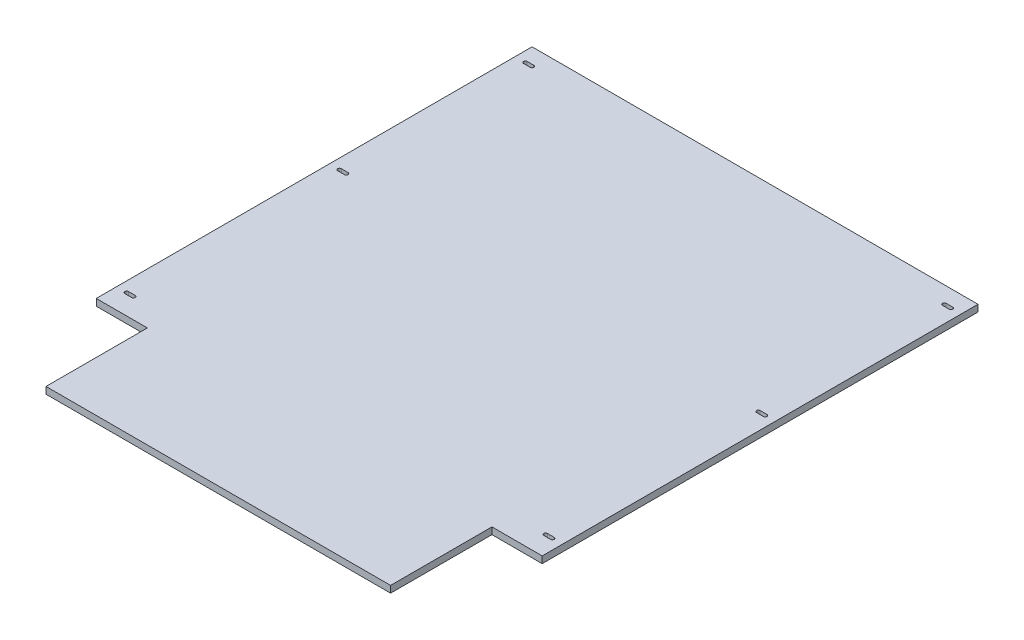
ISO-10303-21;
HEADER;
FILE_DESCRIPTION(('STEP AP214'),'2;1');
FILE_NAME('part.step','',(''),(''),'','','');
FILE_SCHEMA(('AUTOMOTIVE_DESIGN { 1 0 10303 214 1 1 1 1 }'));
ENDSEC;
DATA;
#1=APPLICATION_CONTEXT('core data for automotive mechanical design processes');
#2=APPLICATION_PROTOCOL_DEFINITION('international standard','automotive_design',2000,#1);
#3=PRODUCT_CONTEXT('',#1,'mechanical');
#4=PRODUCT('Part','Part','',(#3));
#5=PRODUCT_RELATED_PRODUCT_CATEGORY('part','',(#4));
#6=PRODUCT_DEFINITION_FORMATION('','',#4);
#7=PRODUCT_DEFINITION_CONTEXT('part definition',#1,'design');
#8=PRODUCT_DEFINITION('design','',#6,#7);
#9=PRODUCT_DEFINITION_SHAPE('','',#8);
#10=(LENGTH_UNIT() NAMED_UNIT(*) SI_UNIT(.MILLI.,.METRE.));
#11=(NAMED_UNIT(*) PLANE_ANGLE_UNIT() SI_UNIT($,.RADIAN.));
#12=(NAMED_UNIT(*) SI_UNIT($,.STERADIAN.) SOLID_ANGLE_UNIT());
#13=UNCERTAINTY_MEASURE_WITH_UNIT(LENGTH_MEASURE(1.E-05),#10,'distance_accuracy_value','');
#14=(GEOMETRIC_REPRESENTATION_CONTEXT(3) GLOBAL_UNCERTAINTY_ASSIGNED_CONTEXT((#13)) GLOBAL_UNIT_ASSIGNED_CONTEXT((#10,
#11,#12)) REPRESENTATION_CONTEXT('',''));
#15=CARTESIAN_POINT('',(0.,0.,0.));
#16=DIRECTION('',(0.,0.,1.));
#17=DIRECTION('',(1.,0.,0.));
#18=AXIS2_PLACEMENT_3D('',#15,#16,#17);
#19=CARTESIAN_POINT('',(0.,12.7,0.));
#20=DIRECTION('',(0.,1.,0.));
#21=DIRECTION('',(0.,0.,1.));
#22=AXIS2_PLACEMENT_3D('',#19,#20,#21);
#23=PLANE('',#22);
#24=DIRECTION('',(0.,0.,1.));
#25=VECTOR('',#24,1.);
#26=CARTESIAN_POINT('',(0.,12.7,-819.15));
#27=LINE('',#26,#25);
#28=CARTESIAN_POINT('',(0.,12.7,-819.15));
#29=VERTEX_POINT('',#28);
#30=CARTESIAN_POINT('',(0.,12.7,0.));
#31=VERTEX_POINT('',#30);
#32=EDGE_CURVE('E433',#29,#31,#27,.T.);
#33=ORIENTED_EDGE('',*,*,#32,.T.);
#34=DIRECTION('',(1.,0.,0.));
#35=VECTOR('',#34,1.);
#36=CARTESIAN_POINT('',(0.,12.7,0.));
#37=LINE('',#36,#35);
#38=CARTESIAN_POINT('',(96.04375,12.7,0.));
#39=VERTEX_POINT('',#38);
#40=EDGE_CURVE('E436',#31,#39,#37,.T.);
#41=ORIENTED_EDGE('',*,*,#40,.T.);
#42=DIRECTION('',(0.,0.,1.));
#43=VECTOR('',#42,1.);
#44=CARTESIAN_POINT('',(96.04375,12.7,0.));
#45=LINE('',#44,#43);
#46=CARTESIAN_POINT('',(96.04375,12.7,190.5));
#47=VERTEX_POINT('',#46);
#48=EDGE_CURVE('E439',#39,#47,#45,.T.);
#49=ORIENTED_EDGE('',*,*,#48,.T.);
#50=DIRECTION('',(1.,0.,0.));
#51=VECTOR('',#50,1.);
#52=CARTESIAN_POINT('',(96.04375,12.7,190.5));
#53=LINE('',#52,#51);
#54=CARTESIAN_POINT('',(743.74375,12.7,190.5));
#55=VERTEX_POINT('',#54);
#56=EDGE_CURVE('E441',#47,#55,#53,.T.);
#57=ORIENTED_EDGE('',*,*,#56,.T.);
#58=DIRECTION('',(0.,0.,-1.));
#59=VECTOR('',#58,1.);
#60=CARTESIAN_POINT('',(743.74375,12.7,190.5));
#61=LINE('',#60,#59);
#62=CARTESIAN_POINT('',(743.74375,12.7,0.));
#63=VERTEX_POINT('',#62);
#64=EDGE_CURVE('E443',#55,#63,#61,.T.);
#65=ORIENTED_EDGE('',*,*,#64,.T.);
#66=DIRECTION('',(1.,0.,0.));
#67=VECTOR('',#66,1.);
#68=CARTESIAN_POINT('',(743.74375,12.7,0.));
#69=LINE('',#68,#67);
#70=CARTESIAN_POINT('',(838.2,12.7,0.));
#71=VERTEX_POINT('',#70);
#72=EDGE_CURVE('E445',#63,#71,#69,.T.);
#73=ORIENTED_EDGE('',*,*,#72,.T.);
#74=DIRECTION('',(0.,0.,-1.));
#75=VECTOR('',#74,1.);
#76=CARTESIAN_POINT('',(838.2,12.7,0.));
#77=LINE('',#76,#75);
#78=CARTESIAN_POINT('',(838.2,12.7,-819.15));
#79=VERTEX_POINT('',#78);
#80=EDGE_CURVE('E447',#71,#79,#77,.T.);
#81=ORIENTED_EDGE('',*,*,#80,.T.);
#82=DIRECTION('',(-1.,0.,0.));
#83=VECTOR('',#82,1.);
#84=CARTESIAN_POINT('',(838.2,12.7,-819.15));
#85=LINE('',#84,#83);
#86=EDGE_CURVE('E449',#79,#29,#85,.T.);
#87=ORIENTED_EDGE('',*,*,#86,.T.);
#88=EDGE_LOOP('',(#33,#41,#49,#57,#65,#73,#81,#87));
#89=FACE_BOUND('',#88,.T.);
#90=DIRECTION('',(1.,0.,0.));
#91=VECTOR('',#90,1.);
#92=CARTESIAN_POINT('',(19.0500000000001,12.7,-34.7218));
#93=LINE('',#92,#91);
#94=CARTESIAN_POINT('',(19.0500000000001,12.7,-34.7218));
#95=VERTEX_POINT('',#94);
#96=CARTESIAN_POINT('',(31.7500000000001,12.7,-34.7218));
#97=VERTEX_POINT('',#96);
#98=EDGE_CURVE('E404',#95,#97,#93,.T.);
#99=ORIENTED_EDGE('',*,*,#98,.F.);
#100=CARTESIAN_POINT('',(19.0500000000001,12.7,-38.1));
#101=DIRECTION('',(0.,1.,0.));
#102=DIRECTION('',(0.,0.,1.));
#103=AXIS2_PLACEMENT_3D('',#100,#101,#102);
#104=CIRCLE('',#103,3.37819999999999);
#105=CARTESIAN_POINT('',(19.0500000000001,12.7,-41.4782));
#106=VERTEX_POINT('',#105);
#107=EDGE_CURVE('E402',#106,#95,#104,.T.);
#108=ORIENTED_EDGE('',*,*,#107,.F.);
#109=DIRECTION('',(-1.,0.,0.));
#110=VECTOR('',#109,1.);
#111=CARTESIAN_POINT('',(19.0500000000001,12.7,-41.4782));
#112=LINE('',#111,#110);
#113=CARTESIAN_POINT('',(31.7500000000001,12.7,-41.4782));
#114=VERTEX_POINT('',#113);
#115=EDGE_CURVE('E410',#114,#106,#112,.T.);
#116=ORIENTED_EDGE('',*,*,#115,.F.);
#117=CARTESIAN_POINT('',(31.7500000000001,12.7,-38.1));
#118=DIRECTION('',(0.,1.,0.));
#119=DIRECTION('',(0.,0.,1.));
#120=AXIS2_PLACEMENT_3D('',#117,#118,#119);
#121=CIRCLE('',#120,3.37819999999999);
#122=EDGE_CURVE('E407',#97,#114,#121,.T.);
#123=ORIENTED_EDGE('',*,*,#122,.F.);
#124=EDGE_LOOP('',(#99,#108,#116,#123));
#125=FACE_BOUND('',#124,.T.);
#126=DIRECTION('',(1.,0.,0.));
#127=VECTOR('',#126,1.);
#128=CARTESIAN_POINT('',(19.0500000000001,12.7,-434.7718));
#129=LINE('',#128,#127);
#130=CARTESIAN_POINT('',(19.0500000000001,12.7,-434.7718));
#131=VERTEX_POINT('',#130);
#132=CARTESIAN_POINT('',(31.7500000000001,12.7,-434.7718));
#133=VERTEX_POINT('',#132);
#134=EDGE_CURVE('E373',#131,#133,#129,.T.);
#135=ORIENTED_EDGE('',*,*,#134,.F.);
#136=CARTESIAN_POINT('',(19.0500000000001,12.7,-438.15));
#137=DIRECTION('',(0.,1.,0.));
#138=DIRECTION('',(0.,0.,1.));
#139=AXIS2_PLACEMENT_3D('',#136,#137,#138);
#140=CIRCLE('',#139,3.37820000000016);
#141=CARTESIAN_POINT('',(19.0500000000001,12.7,-441.5282));
#142=VERTEX_POINT('',#141);
#143=EDGE_CURVE('E371',#142,#131,#140,.T.);
#144=ORIENTED_EDGE('',*,*,#143,.F.);
#145=DIRECTION('',(-1.,0.,0.));
#146=VECTOR('',#145,1.);
#147=CARTESIAN_POINT('',(19.0500000000001,12.7,-441.5282));
#148=LINE('',#147,#146);
#149=CARTESIAN_POINT('',(31.7500000000001,12.7,-441.5282));
#150=VERTEX_POINT('',#149);
#151=EDGE_CURVE('E379',#150,#142,#148,.T.);
#152=ORIENTED_EDGE('',*,*,#151,.F.);
#153=CARTESIAN_POINT('',(31.7500000000001,12.7,-438.15));
#154=DIRECTION('',(0.,1.,0.));
#155=DIRECTION('',(0.,0.,1.));
#156=AXIS2_PLACEMENT_3D('',#153,#154,#155);
#157=CIRCLE('',#156,3.37820000000016);
#158=EDGE_CURVE('E376',#133,#150,#157,.T.);
#159=ORIENTED_EDGE('',*,*,#158,.F.);
#160=EDGE_LOOP('',(#135,#144,#152,#159));
#161=FACE_BOUND('',#160,.T.);
#162=DIRECTION('',(-1.,0.,0.));
#163=VECTOR('',#162,1.);
#164=CARTESIAN_POINT('',(31.7500000000001,12.7,-790.7782));
#165=LINE('',#164,#163);
#166=CARTESIAN_POINT('',(31.7500000000001,12.7,-790.7782));
#167=VERTEX_POINT('',#166);
#168=CARTESIAN_POINT('',(19.0500000000001,12.7,-790.7782));
#169=VERTEX_POINT('',#168);
#170=EDGE_CURVE('E342',#167,#169,#165,.T.);
#171=ORIENTED_EDGE('',*,*,#170,.F.);
#172=CARTESIAN_POINT('',(31.7500000000001,12.7,-787.4));
#173=DIRECTION('',(0.,1.,0.));
#174=DIRECTION('',(0.,0.,1.));
#175=AXIS2_PLACEMENT_3D('',#172,#173,#174);
#176=CIRCLE('',#175,3.3782);
#177=CARTESIAN_POINT('',(31.75,12.7,-784.0218));
#178=VERTEX_POINT('',#177);
#179=EDGE_CURVE('E340',#178,#167,#176,.T.);
#180=ORIENTED_EDGE('',*,*,#179,.F.);
#181=DIRECTION('',(1.,0.,0.));
#182=VECTOR('',#181,1.);
#183=CARTESIAN_POINT('',(31.75,12.7,-784.0218));
#184=LINE('',#183,#182);
#185=CARTESIAN_POINT('',(19.0500000000001,12.7,-784.0218));
#186=VERTEX_POINT('',#185);
#187=EDGE_CURVE('E348',#186,#178,#184,.T.);
#188=ORIENTED_EDGE('',*,*,#187,.F.);
#189=CARTESIAN_POINT('',(19.0500000000001,12.7,-787.4));
#190=DIRECTION('',(0.,1.,0.));
#191=DIRECTION('',(0.,0.,1.));
#192=AXIS2_PLACEMENT_3D('',#189,#190,#191);
#193=CIRCLE('',#192,3.3782);
#194=EDGE_CURVE('E345',#169,#186,#193,.T.);
#195=ORIENTED_EDGE('',*,*,#194,.F.);
#196=EDGE_LOOP('',(#171,#180,#188,#195));
#197=FACE_BOUND('',#196,.T.);
#198=DIRECTION('',(1.,0.,0.));
#199=VECTOR('',#198,1.);
#200=CARTESIAN_POINT('',(806.45,12.7,-784.0218));
#201=LINE('',#200,#199);
#202=CARTESIAN_POINT('',(806.45,12.7,-784.0218));
#203=VERTEX_POINT('',#202);
#204=CARTESIAN_POINT('',(819.15,12.7,-784.0218));
#205=VERTEX_POINT('',#204);
#206=EDGE_CURVE('E311',#203,#205,#201,.T.);
#207=ORIENTED_EDGE('',*,*,#206,.F.);
#208=CARTESIAN_POINT('',(806.45,12.7,-787.4));
#209=DIRECTION('',(0.,1.,0.));
#210=DIRECTION('',(0.,0.,-1.));
#211=AXIS2_PLACEMENT_3D('',#208,#209,#210);
#212=CIRCLE('',#211,3.3782);
#213=CARTESIAN_POINT('',(806.45,12.7,-790.7782));
#214=VERTEX_POINT('',#213);
#215=EDGE_CURVE('E309',#214,#203,#212,.T.);
#216=ORIENTED_EDGE('',*,*,#215,.F.);
#217=DIRECTION('',(-1.,0.,0.));
#218=VECTOR('',#217,1.);
#219=CARTESIAN_POINT('',(806.45,12.7,-790.7782));
#220=LINE('',#219,#218);
#221=CARTESIAN_POINT('',(819.15,12.7,-790.7782));
#222=VERTEX_POINT('',#221);
#223=EDGE_CURVE('E317',#222,#214,#220,.T.);
#224=ORIENTED_EDGE('',*,*,#223,.F.);
#225=CARTESIAN_POINT('',(819.15,12.7,-787.4));
#226=DIRECTION('',(0.,1.,0.));
#227=DIRECTION('',(0.,0.,-1.));
#228=AXIS2_PLACEMENT_3D('',#225,#226,#227);
#229=CIRCLE('',#228,3.3782);
#230=EDGE_CURVE('E314',#205,#222,#229,.T.);
#231=ORIENTED_EDGE('',*,*,#230,.F.);
#232=EDGE_LOOP('',(#207,#216,#224,#231));
#233=FACE_BOUND('',#232,.T.);
#234=DIRECTION('',(-1.,0.,0.));
#235=VECTOR('',#234,1.);
#236=CARTESIAN_POINT('',(819.15,12.7,-441.5282));
#237=LINE('',#236,#235);
#238=CARTESIAN_POINT('',(819.15,12.7,-441.5282));
#239=VERTEX_POINT('',#238);
#240=CARTESIAN_POINT('',(806.45,12.7,-441.5282));
#241=VERTEX_POINT('',#240);
#242=EDGE_CURVE('E280',#239,#241,#237,.T.);
#243=ORIENTED_EDGE('',*,*,#242,.F.);
#244=CARTESIAN_POINT('',(819.15,12.7,-438.15));
#245=DIRECTION('',(0.,1.,0.));
#246=DIRECTION('',(0.,0.,-1.));
#247=AXIS2_PLACEMENT_3D('',#244,#245,#246);
#248=CIRCLE('',#247,3.3782);
#249=CARTESIAN_POINT('',(819.15,12.7,-434.7718));
#250=VERTEX_POINT('',#249);
#251=EDGE_CURVE('E278',#250,#239,#248,.T.);
#252=ORIENTED_EDGE('',*,*,#251,.F.);
#253=DIRECTION('',(1.,0.,0.));
#254=VECTOR('',#253,1.);
#255=CARTESIAN_POINT('',(819.15,12.7,-434.7718));
#256=LINE('',#255,#254);
#257=CARTESIAN_POINT('',(806.45,12.7,-434.7718));
#258=VERTEX_POINT('',#257);
#259=EDGE_CURVE('E286',#258,#250,#256,.T.);
#260=ORIENTED_EDGE('',*,*,#259,.F.);
#261=CARTESIAN_POINT('',(806.45,12.7,-438.15));
#262=DIRECTION('',(0.,1.,0.));
#263=DIRECTION('',(0.,0.,-1.));
#264=AXIS2_PLACEMENT_3D('',#261,#262,#263);
#265=CIRCLE('',#264,3.3782);
#266=EDGE_CURVE('E283',#241,#258,#265,.T.);
#267=ORIENTED_EDGE('',*,*,#266,.F.);
#268=EDGE_LOOP('',(#243,#252,#260,#267));
#269=FACE_BOUND('',#268,.T.);
#270=DIRECTION('',(-1.,0.,0.));
#271=VECTOR('',#270,1.);
#272=CARTESIAN_POINT('',(819.15,12.7,-41.4782));
#273=LINE('',#272,#271);
#274=CARTESIAN_POINT('',(819.15,12.7,-41.4782));
#275=VERTEX_POINT('',#274);
#276=CARTESIAN_POINT('',(806.45,12.7,-41.4782));
#277=VERTEX_POINT('',#276);
#278=EDGE_CURVE('E250',#275,#277,#273,.T.);
#279=ORIENTED_EDGE('',*,*,#278,.F.);
#280=CARTESIAN_POINT('',(819.15,12.7,-38.1));
#281=DIRECTION('',(0.,1.,0.));
#282=DIRECTION('',(0.,0.,-1.));
#283=AXIS2_PLACEMENT_3D('',#280,#281,#282);
#284=CIRCLE('',#283,3.3782);
#285=CARTESIAN_POINT('',(819.15,12.7,-34.7218));
#286=VERTEX_POINT('',#285);
#287=EDGE_CURVE('E242',#286,#275,#284,.T.);
#288=ORIENTED_EDGE('',*,*,#287,.F.);
#289=DIRECTION('',(1.,0.,0.));
#290=VECTOR('',#289,1.);
#291=CARTESIAN_POINT('',(819.15,12.7,-34.7218));
#292=LINE('',#291,#290);
#293=CARTESIAN_POINT('',(806.45,12.7,-34.7218));
#294=VERTEX_POINT('',#293);
#295=EDGE_CURVE('E264',#294,#286,#292,.T.);
#296=ORIENTED_EDGE('',*,*,#295,.F.);
#297=CARTESIAN_POINT('',(806.45,12.7,-38.1));
#298=DIRECTION('',(0.,1.,0.));
#299=DIRECTION('',(0.,0.,-1.));
#300=AXIS2_PLACEMENT_3D('',#297,#298,#299);
#301=CIRCLE('',#300,3.3782);
#302=EDGE_CURVE('E262',#277,#294,#301,.T.);
#303=ORIENTED_EDGE('',*,*,#302,.F.);
#304=EDGE_LOOP('',(#279,#288,#296,#303));
#305=FACE_BOUND('',#304,.T.);
#306=ADVANCED_FACE('F33',(#89,#125,#161,#197,#233,#269,#305),#23,.T.);
#307=CARTESIAN_POINT('',(0.,0.,0.));
#308=DIRECTION('',(0.,1.,0.));
#309=DIRECTION('',(0.,0.,1.));
#310=AXIS2_PLACEMENT_3D('',#307,#308,#309);
#311=PLANE('',#310);
#312=CARTESIAN_POINT('',(819.15,0.,-438.15));
#313=DIRECTION('',(0.,1.,0.));
#314=DIRECTION('',(0.,0.,-1.));
#315=AXIS2_PLACEMENT_3D('',#312,#313,#314);
#316=CIRCLE('',#315,3.3782);
#317=CARTESIAN_POINT('',(819.15,0.,-434.7718));
#318=VERTEX_POINT('',#317);
#319=CARTESIAN_POINT('',(819.15,0.,-441.5282));
#320=VERTEX_POINT('',#319);
#321=EDGE_CURVE('E258',#318,#320,#316,.T.);
#322=ORIENTED_EDGE('',*,*,#321,.T.);
#323=DIRECTION('',(-1.,0.,0.));
#324=VECTOR('',#323,1.);
#325=CARTESIAN_POINT('',(819.15,0.,-441.5282));
#326=LINE('',#325,#324);
#327=CARTESIAN_POINT('',(806.45,0.,-441.5282));
#328=VERTEX_POINT('',#327);
#329=EDGE_CURVE('E291',#320,#328,#326,.T.);
#330=ORIENTED_EDGE('',*,*,#329,.T.);
#331=CARTESIAN_POINT('',(806.45,0.,-438.15));
#332=DIRECTION('',(0.,1.,0.));
#333=DIRECTION('',(0.,0.,-1.));
#334=AXIS2_PLACEMENT_3D('',#331,#332,#333);
#335=CIRCLE('',#334,3.3782);
#336=CARTESIAN_POINT('',(806.45,0.,-434.7718));
#337=VERTEX_POINT('',#336);
#338=EDGE_CURVE('E294',#328,#337,#335,.T.);
#339=ORIENTED_EDGE('',*,*,#338,.T.);
#340=DIRECTION('',(1.,0.,0.));
#341=VECTOR('',#340,1.);
#342=CARTESIAN_POINT('',(819.15,0.,-434.7718));
#343=LINE('',#342,#341);
#344=EDGE_CURVE('E281',#337,#318,#343,.T.);
#345=ORIENTED_EDGE('',*,*,#344,.T.);
#346=EDGE_LOOP('',(#322,#330,#339,#345));
#347=FACE_BOUND('',#346,.T.);
#348=CARTESIAN_POINT('',(31.7500000000001,0.,-787.4));
#349=DIRECTION('',(0.,1.,0.));
#350=DIRECTION('',(0.,0.,1.));
#351=AXIS2_PLACEMENT_3D('',#348,#349,#350);
#352=CIRCLE('',#351,3.3782);
#353=CARTESIAN_POINT('',(31.75,0.,-784.0218));
#354=VERTEX_POINT('',#353);
#355=CARTESIAN_POINT('',(31.7500000000001,0.,-790.7782));
#356=VERTEX_POINT('',#355);
#357=EDGE_CURVE('E339',#354,#356,#352,.T.);
#358=ORIENTED_EDGE('',*,*,#357,.T.);
#359=DIRECTION('',(-1.,0.,0.));
#360=VECTOR('',#359,1.);
#361=CARTESIAN_POINT('',(31.7500000000001,0.,-790.7782));
#362=LINE('',#361,#360);
#363=CARTESIAN_POINT('',(19.0500000000001,0.,-790.7782));
#364=VERTEX_POINT('',#363);
#365=EDGE_CURVE('E353',#356,#364,#362,.T.);
#366=ORIENTED_EDGE('',*,*,#365,.T.);
#367=CARTESIAN_POINT('',(19.0500000000001,0.,-787.4));
#368=DIRECTION('',(0.,1.,0.));
#369=DIRECTION('',(0.,0.,1.));
#370=AXIS2_PLACEMENT_3D('',#367,#368,#369);
#371=CIRCLE('',#370,3.3782);
#372=CARTESIAN_POINT('',(19.0500000000001,0.,-784.0218));
#373=VERTEX_POINT('',#372);
#374=EDGE_CURVE('E356',#364,#373,#371,.T.);
#375=ORIENTED_EDGE('',*,*,#374,.T.);
#376=DIRECTION('',(1.,0.,0.));
#377=VECTOR('',#376,1.);
#378=CARTESIAN_POINT('',(31.75,0.,-784.0218));
#379=LINE('',#378,#377);
#380=EDGE_CURVE('E343',#373,#354,#379,.T.);
#381=ORIENTED_EDGE('',*,*,#380,.T.);
#382=EDGE_LOOP('',(#358,#366,#375,#381));
#383=FACE_BOUND('',#382,.T.);
#384=CARTESIAN_POINT('',(19.0500000000001,0.,-38.1));
#385=DIRECTION('',(0.,1.,0.));
#386=DIRECTION('',(0.,0.,1.));
#387=AXIS2_PLACEMENT_3D('',#384,#385,#386);
#388=CIRCLE('',#387,3.37819999999999);
#389=CARTESIAN_POINT('',(19.0500000000001,0.,-41.4782));
#390=VERTEX_POINT('',#389);
#391=CARTESIAN_POINT('',(19.0500000000001,0.,-34.7218));
#392=VERTEX_POINT('',#391);
#393=EDGE_CURVE('E401',#390,#392,#388,.T.);
#394=ORIENTED_EDGE('',*,*,#393,.T.);
#395=DIRECTION('',(1.,0.,0.));
#396=VECTOR('',#395,1.);
#397=CARTESIAN_POINT('',(19.0500000000001,0.,-34.7218));
#398=LINE('',#397,#396);
#399=CARTESIAN_POINT('',(31.7500000000001,0.,-34.7218));
#400=VERTEX_POINT('',#399);
#401=EDGE_CURVE('E415',#392,#400,#398,.T.);
#402=ORIENTED_EDGE('',*,*,#401,.T.);
#403=CARTESIAN_POINT('',(31.7500000000001,0.,-38.1));
#404=DIRECTION('',(0.,1.,0.));
#405=DIRECTION('',(0.,0.,1.));
#406=AXIS2_PLACEMENT_3D('',#403,#404,#405);
#407=CIRCLE('',#406,3.37819999999999);
#408=CARTESIAN_POINT('',(31.7500000000001,0.,-41.4782));
#409=VERTEX_POINT('',#408);
#410=EDGE_CURVE('E418',#400,#409,#407,.T.);
#411=ORIENTED_EDGE('',*,*,#410,.T.);
#412=DIRECTION('',(-1.,0.,0.));
#413=VECTOR('',#412,1.);
#414=CARTESIAN_POINT('',(19.0500000000001,0.,-41.4782));
#415=LINE('',#414,#413);
#416=EDGE_CURVE('E405',#409,#390,#415,.T.);
#417=ORIENTED_EDGE('',*,*,#416,.T.);
#418=EDGE_LOOP('',(#394,#402,#411,#417));
#419=FACE_BOUND('',#418,.T.);
#420=DIRECTION('',(0.,0.,1.));
#421=VECTOR('',#420,1.);
#422=CARTESIAN_POINT('',(0.,0.,-819.15));
#423=LINE('',#422,#421);
#424=CARTESIAN_POINT('',(0.,0.,-819.15));
#425=VERTEX_POINT('',#424);
#426=CARTESIAN_POINT('',(0.,0.,0.));
#427=VERTEX_POINT('',#426);
#428=EDGE_CURVE('E432',#425,#427,#423,.T.);
#429=ORIENTED_EDGE('',*,*,#428,.F.);
#430=DIRECTION('',(-1.,0.,0.));
#431=VECTOR('',#430,1.);
#432=CARTESIAN_POINT('',(838.2,0.,-819.15));
#433=LINE('',#432,#431);
#434=CARTESIAN_POINT('',(838.2,0.,-819.15));
#435=VERTEX_POINT('',#434);
#436=EDGE_CURVE('E437',#435,#425,#433,.T.);
#437=ORIENTED_EDGE('',*,*,#436,.F.);
#438=DIRECTION('',(0.,0.,-1.));
#439=VECTOR('',#438,1.);
#440=CARTESIAN_POINT('',(838.2,0.,0.));
#441=LINE('',#440,#439);
#442=CARTESIAN_POINT('',(838.2,0.,0.));
#443=VERTEX_POINT('',#442);
#444=EDGE_CURVE('E464',#443,#435,#441,.T.);
#445=ORIENTED_EDGE('',*,*,#444,.F.);
#446=DIRECTION('',(1.,0.,0.));
#447=VECTOR('',#446,1.);
#448=CARTESIAN_POINT('',(743.74375,0.,0.));
#449=LINE('',#448,#447);
#450=CARTESIAN_POINT('',(743.74375,0.,0.));
#451=VERTEX_POINT('',#450);
#452=EDGE_CURVE('E462',#451,#443,#449,.T.);
#453=ORIENTED_EDGE('',*,*,#452,.F.);
#454=DIRECTION('',(0.,0.,-1.));
#455=VECTOR('',#454,1.);
#456=CARTESIAN_POINT('',(743.74375,0.,190.5));
#457=LINE('',#456,#455);
#458=CARTESIAN_POINT('',(743.74375,0.,190.5));
#459=VERTEX_POINT('',#458);
#460=EDGE_CURVE('E460',#459,#451,#457,.T.);
#461=ORIENTED_EDGE('',*,*,#460,.F.);
#462=DIRECTION('',(1.,0.,0.));
#463=VECTOR('',#462,1.);
#464=CARTESIAN_POINT('',(96.04375,0.,190.5));
#465=LINE('',#464,#463);
#466=CARTESIAN_POINT('',(96.04375,0.,190.5));
#467=VERTEX_POINT('',#466);
#468=EDGE_CURVE('E458',#467,#459,#465,.T.);
#469=ORIENTED_EDGE('',*,*,#468,.F.);
#470=DIRECTION('',(0.,0.,1.));
#471=VECTOR('',#470,1.);
#472=CARTESIAN_POINT('',(96.04375,0.,0.));
#473=LINE('',#472,#471);
#474=CARTESIAN_POINT('',(96.04375,0.,0.));
#475=VERTEX_POINT('',#474);
#476=EDGE_CURVE('E456',#475,#467,#473,.T.);
#477=ORIENTED_EDGE('',*,*,#476,.F.);
#478=DIRECTION('',(1.,0.,0.));
#479=VECTOR('',#478,1.);
#480=CARTESIAN_POINT('',(0.,0.,0.));
#481=LINE('',#480,#479);
#482=EDGE_CURVE('E454',#427,#475,#481,.T.);
#483=ORIENTED_EDGE('',*,*,#482,.F.);
#484=EDGE_LOOP('',(#429,#437,#445,#453,#461,#469,#477,#483));
#485=FACE_BOUND('',#484,.T.);
#486=CARTESIAN_POINT('',(19.0500000000001,0.,-438.15));
#487=DIRECTION('',(0.,1.,0.));
#488=DIRECTION('',(0.,0.,1.));
#489=AXIS2_PLACEMENT_3D('',#486,#487,#488);
#490=CIRCLE('',#489,3.37820000000016);
#491=CARTESIAN_POINT('',(19.0500000000001,0.,-441.5282));
#492=VERTEX_POINT('',#491);
#493=CARTESIAN_POINT('',(19.0500000000001,0.,-434.7718));
#494=VERTEX_POINT('',#493);
#495=EDGE_CURVE('E370',#492,#494,#490,.T.);
#496=ORIENTED_EDGE('',*,*,#495,.T.);
#497=DIRECTION('',(1.,0.,0.));
#498=VECTOR('',#497,1.);
#499=CARTESIAN_POINT('',(19.0500000000001,0.,-434.7718));
#500=LINE('',#499,#498);
#501=CARTESIAN_POINT('',(31.7500000000001,0.,-434.7718));
#502=VERTEX_POINT('',#501);
#503=EDGE_CURVE('E384',#494,#502,#500,.T.);
#504=ORIENTED_EDGE('',*,*,#503,.T.);
#505=CARTESIAN_POINT('',(31.7500000000001,0.,-438.15));
#506=DIRECTION('',(0.,1.,0.));
#507=DIRECTION('',(0.,0.,1.));
#508=AXIS2_PLACEMENT_3D('',#505,#506,#507);
#509=CIRCLE('',#508,3.37820000000016);
#510=CARTESIAN_POINT('',(31.7500000000001,0.,-441.5282));
#511=VERTEX_POINT('',#510);
#512=EDGE_CURVE('E387',#502,#511,#509,.T.);
#513=ORIENTED_EDGE('',*,*,#512,.T.);
#514=DIRECTION('',(-1.,0.,0.));
#515=VECTOR('',#514,1.);
#516=CARTESIAN_POINT('',(19.0500000000001,0.,-441.5282));
#517=LINE('',#516,#515);
#518=EDGE_CURVE('E374',#511,#492,#517,.T.);
#519=ORIENTED_EDGE('',*,*,#518,.T.);
#520=EDGE_LOOP('',(#496,#504,#513,#519));
#521=FACE_BOUND('',#520,.T.);
#522=CARTESIAN_POINT('',(806.45,0.,-787.4));
#523=DIRECTION('',(0.,1.,0.));
#524=DIRECTION('',(0.,0.,-1.));
#525=AXIS2_PLACEMENT_3D('',#522,#523,#524);
#526=CIRCLE('',#525,3.3782);
#527=CARTESIAN_POINT('',(806.45,0.,-790.7782));
#528=VERTEX_POINT('',#527);
#529=CARTESIAN_POINT('',(806.45,0.,-784.0218));
#530=VERTEX_POINT('',#529);
#531=EDGE_CURVE('E308',#528,#530,#526,.T.);
#532=ORIENTED_EDGE('',*,*,#531,.T.);
#533=DIRECTION('',(1.,0.,0.));
#534=VECTOR('',#533,1.);
#535=CARTESIAN_POINT('',(806.45,0.,-784.0218));
#536=LINE('',#535,#534);
#537=CARTESIAN_POINT('',(819.15,0.,-784.0218));
#538=VERTEX_POINT('',#537);
#539=EDGE_CURVE('E322',#530,#538,#536,.T.);
#540=ORIENTED_EDGE('',*,*,#539,.T.);
#541=CARTESIAN_POINT('',(819.15,0.,-787.4));
#542=DIRECTION('',(0.,1.,0.));
#543=DIRECTION('',(0.,0.,-1.));
#544=AXIS2_PLACEMENT_3D('',#541,#542,#543);
#545=CIRCLE('',#544,3.3782);
#546=CARTESIAN_POINT('',(819.15,0.,-790.7782));
#547=VERTEX_POINT('',#546);
#548=EDGE_CURVE('E325',#538,#547,#545,.T.);
#549=ORIENTED_EDGE('',*,*,#548,.T.);
#550=DIRECTION('',(-1.,0.,0.));
#551=VECTOR('',#550,1.);
#552=CARTESIAN_POINT('',(806.45,0.,-790.7782));
#553=LINE('',#552,#551);
#554=EDGE_CURVE('E312',#547,#528,#553,.T.);
#555=ORIENTED_EDGE('',*,*,#554,.T.);
#556=EDGE_LOOP('',(#532,#540,#549,#555));
#557=FACE_BOUND('',#556,.T.);
#558=CARTESIAN_POINT('',(819.15,0.,-38.1));
#559=DIRECTION('',(0.,1.,0.));
#560=DIRECTION('',(0.,0.,-1.));
#561=AXIS2_PLACEMENT_3D('',#558,#559,#560);
#562=CIRCLE('',#561,3.3782);
#563=CARTESIAN_POINT('',(819.15,0.,-34.7218));
#564=VERTEX_POINT('',#563);
#565=CARTESIAN_POINT('',(819.15,0.,-41.4782));
#566=VERTEX_POINT('',#565);
#567=EDGE_CURVE('E56',#564,#566,#562,.T.);
#568=ORIENTED_EDGE('',*,*,#567,.T.);
#569=DIRECTION('',(-1.,0.,0.));
#570=VECTOR('',#569,1.);
#571=CARTESIAN_POINT('',(819.15,0.,-41.4782));
#572=LINE('',#571,#570);
#573=CARTESIAN_POINT('',(806.45,0.,-41.4782));
#574=VERTEX_POINT('',#573);
#575=EDGE_CURVE('E257',#566,#574,#572,.T.);
#576=ORIENTED_EDGE('',*,*,#575,.T.);
#577=CARTESIAN_POINT('',(806.45,0.,-38.1));
#578=DIRECTION('',(0.,1.,0.));
#579=DIRECTION('',(0.,0.,-1.));
#580=AXIS2_PLACEMENT_3D('',#577,#578,#579);
#581=CIRCLE('',#580,3.3782);
#582=CARTESIAN_POINT('',(806.45,0.,-34.7218));
#583=VERTEX_POINT('',#582);
#584=EDGE_CURVE('E270',#574,#583,#581,.T.);
#585=ORIENTED_EDGE('',*,*,#584,.T.);
#586=DIRECTION('',(1.,0.,0.));
#587=VECTOR('',#586,1.);
#588=CARTESIAN_POINT('',(819.15,0.,-34.7218));
#589=LINE('',#588,#587);
#590=EDGE_CURVE('E251',#583,#564,#589,.T.);
#591=ORIENTED_EDGE('',*,*,#590,.T.);
#592=EDGE_LOOP('',(#568,#576,#585,#591));
#593=FACE_BOUND('',#592,.T.);
#594=ADVANCED_FACE('F494',(#347,#383,#419,#485,#521,#557,#593),#311,.F.);
#595=CARTESIAN_POINT('',(0.,12.7,-819.15));
#596=DIRECTION('',(1.,0.,0.));
#597=DIRECTION('',(0.,0.,-1.));
#598=AXIS2_PLACEMENT_3D('',#595,#596,#597);
#599=PLANE('',#598);
#600=ORIENTED_EDGE('',*,*,#428,.T.);
#601=DIRECTION('',(0.,-1.,0.));
#602=VECTOR('',#601,1.);
#603=CARTESIAN_POINT('',(0.,12.7,0.));
#604=LINE('',#603,#602);
#605=EDGE_CURVE('E11',#31,#427,#604,.T.);
#606=ORIENTED_EDGE('',*,*,#605,.F.);
#607=ORIENTED_EDGE('',*,*,#32,.F.);
#608=DIRECTION('',(0.,-1.,0.));
#609=VECTOR('',#608,1.);
#610=CARTESIAN_POINT('',(0.,12.7,-819.15));
#611=LINE('',#610,#609);
#612=EDGE_CURVE('E451',#29,#425,#611,.T.);
#613=ORIENTED_EDGE('',*,*,#612,.T.);
#614=EDGE_LOOP('',(#600,#606,#607,#613));
#615=FACE_BOUND('',#614,.T.);
#616=ADVANCED_FACE('F35',(#615),#599,.F.);
#617=CARTESIAN_POINT('',(0.,12.7,0.));
#618=DIRECTION('',(0.,0.,-1.));
#619=DIRECTION('',(-1.,0.,0.));
#620=AXIS2_PLACEMENT_3D('',#617,#618,#619);
#621=PLANE('',#620);
#622=ORIENTED_EDGE('',*,*,#482,.T.);
#623=DIRECTION('',(0.,-1.,0.));
#624=VECTOR('',#623,1.);
#625=CARTESIAN_POINT('',(96.04375,12.7,0.));
#626=LINE('',#625,#624);
#627=EDGE_CURVE('E41',#39,#475,#626,.T.);
#628=ORIENTED_EDGE('',*,*,#627,.F.);
#629=ORIENTED_EDGE('',*,*,#40,.F.);
#630=ORIENTED_EDGE('',*,*,#605,.T.);
#631=EDGE_LOOP('',(#622,#628,#629,#630));
#632=FACE_BOUND('',#631,.T.);
#633=ADVANCED_FACE('F512',(#632),#621,.F.);
#634=CARTESIAN_POINT('',(96.04375,12.7,0.));
#635=DIRECTION('',(1.,0.,0.));
#636=DIRECTION('',(0.,0.,-1.));
#637=AXIS2_PLACEMENT_3D('',#634,#635,#636);
#638=PLANE('',#637);
#639=ORIENTED_EDGE('',*,*,#476,.T.);
#640=DIRECTION('',(0.,-1.,0.));
#641=VECTOR('',#640,1.);
#642=CARTESIAN_POINT('',(96.04375,12.7,190.5));
#643=LINE('',#642,#641);
#644=EDGE_CURVE('E481',#47,#467,#643,.T.);
#645=ORIENTED_EDGE('',*,*,#644,.F.);
#646=ORIENTED_EDGE('',*,*,#48,.F.);
#647=ORIENTED_EDGE('',*,*,#627,.T.);
#648=EDGE_LOOP('',(#639,#645,#646,#647));
#649=FACE_BOUND('',#648,.T.);
#650=ADVANCED_FACE('F488',(#649),#638,.F.);
#651=CARTESIAN_POINT('',(96.04375,12.7,190.5));
#652=DIRECTION('',(0.,0.,-1.));
#653=DIRECTION('',(-1.,0.,0.));
#654=AXIS2_PLACEMENT_3D('',#651,#652,#653);
#655=PLANE('',#654);
#656=ORIENTED_EDGE('',*,*,#468,.T.);
#657=DIRECTION('',(0.,-1.,0.));
#658=VECTOR('',#657,1.);
#659=CARTESIAN_POINT('',(743.74375,12.7,190.5));
#660=LINE('',#659,#658);
#661=EDGE_CURVE('E478',#55,#459,#660,.T.);
#662=ORIENTED_EDGE('',*,*,#661,.F.);
#663=ORIENTED_EDGE('',*,*,#56,.F.);
#664=ORIENTED_EDGE('',*,*,#644,.T.);
#665=EDGE_LOOP('',(#656,#662,#663,#664));
#666=FACE_BOUND('',#665,.T.);
#667=ADVANCED_FACE('F500',(#666),#655,.F.);
#668=CARTESIAN_POINT('',(743.74375,12.7,190.5));
#669=DIRECTION('',(-1.,0.,0.));
#670=DIRECTION('',(0.,0.,1.));
#671=AXIS2_PLACEMENT_3D('',#668,#669,#670);
#672=PLANE('',#671);
#673=ORIENTED_EDGE('',*,*,#460,.T.);
#674=DIRECTION('',(0.,-1.,0.));
#675=VECTOR('',#674,1.);
#676=CARTESIAN_POINT('',(743.74375,12.7,0.));
#677=LINE('',#676,#675);
#678=EDGE_CURVE('E475',#63,#451,#677,.T.);
#679=ORIENTED_EDGE('',*,*,#678,.F.);
#680=ORIENTED_EDGE('',*,*,#64,.F.);
#681=ORIENTED_EDGE('',*,*,#661,.T.);
#682=EDGE_LOOP('',(#673,#679,#680,#681));
#683=FACE_BOUND('',#682,.T.);
#684=ADVANCED_FACE('F504',(#683),#672,.F.);
#685=CARTESIAN_POINT('',(743.74375,12.7,0.));
#686=DIRECTION('',(0.,0.,-1.));
#687=DIRECTION('',(-1.,0.,0.));
#688=AXIS2_PLACEMENT_3D('',#685,#686,#687);
#689=PLANE('',#688);
#690=ORIENTED_EDGE('',*,*,#452,.T.);
#691=DIRECTION('',(0.,-1.,0.));
#692=VECTOR('',#691,1.);
#693=CARTESIAN_POINT('',(838.2,12.7,0.));
#694=LINE('',#693,#692);
#695=EDGE_CURVE('E472',#71,#443,#694,.T.);
#696=ORIENTED_EDGE('',*,*,#695,.F.);
#697=ORIENTED_EDGE('',*,*,#72,.F.);
#698=ORIENTED_EDGE('',*,*,#678,.T.);
#699=EDGE_LOOP('',(#690,#696,#697,#698));
#700=FACE_BOUND('',#699,.T.);
#701=ADVANCED_FACE('F525',(#700),#689,.F.);
#702=CARTESIAN_POINT('',(838.2,12.7,0.));
#703=DIRECTION('',(-1.,0.,0.));
#704=DIRECTION('',(0.,0.,1.));
#705=AXIS2_PLACEMENT_3D('',#702,#703,#704);
#706=PLANE('',#705);
#707=ORIENTED_EDGE('',*,*,#444,.T.);
#708=DIRECTION('',(0.,-1.,0.));
#709=VECTOR('',#708,1.);
#710=CARTESIAN_POINT('',(838.2,12.7,-819.15));
#711=LINE('',#710,#709);
#712=EDGE_CURVE('E469',#79,#435,#711,.T.);
#713=ORIENTED_EDGE('',*,*,#712,.F.);
#714=ORIENTED_EDGE('',*,*,#80,.F.);
#715=ORIENTED_EDGE('',*,*,#695,.T.);
#716=EDGE_LOOP('',(#707,#713,#714,#715));
#717=FACE_BOUND('',#716,.T.);
#718=ADVANCED_FACE('F523',(#717),#706,.F.);
#719=CARTESIAN_POINT('',(838.2,12.7,-819.15));
#720=DIRECTION('',(0.,0.,1.));
#721=DIRECTION('',(1.,0.,0.));
#722=AXIS2_PLACEMENT_3D('',#719,#720,#721);
#723=PLANE('',#722);
#724=ORIENTED_EDGE('',*,*,#436,.T.);
#725=ORIENTED_EDGE('',*,*,#612,.F.);
#726=ORIENTED_EDGE('',*,*,#86,.F.);
#727=ORIENTED_EDGE('',*,*,#712,.T.);
#728=EDGE_LOOP('',(#724,#725,#726,#727));
#729=FACE_BOUND('',#728,.T.);
#730=ADVANCED_FACE('F518',(#729),#723,.F.);
#731=CARTESIAN_POINT('',(19.0500000000001,12.7,-38.1));
#732=DIRECTION('',(0.,-1.,0.));
#733=DIRECTION('',(0.,0.,-1.));
#734=AXIS2_PLACEMENT_3D('',#731,#732,#733);
#735=CYLINDRICAL_SURFACE('',#734,3.37819999999999);
#736=ORIENTED_EDGE('',*,*,#393,.F.);
#737=DIRECTION('',(0.,-1.,0.));
#738=VECTOR('',#737,1.);
#739=CARTESIAN_POINT('',(19.0500000000001,12.7,-41.4782));
#740=LINE('',#739,#738);
#741=EDGE_CURVE('E412',#106,#390,#740,.T.);
#742=ORIENTED_EDGE('',*,*,#741,.F.);
#743=ORIENTED_EDGE('',*,*,#107,.T.);
#744=DIRECTION('',(0.,-1.,0.));
#745=VECTOR('',#744,1.);
#746=CARTESIAN_POINT('',(19.0500000000001,12.7,-34.7218));
#747=LINE('',#746,#745);
#748=EDGE_CURVE('E429',#95,#392,#747,.T.);
#749=ORIENTED_EDGE('',*,*,#748,.T.);
#750=EDGE_LOOP('',(#736,#742,#743,#749));
#751=FACE_BOUND('',#750,.T.);
#752=ADVANCED_FACE('F542',(#751),#735,.F.);
#753=CARTESIAN_POINT('',(19.0500000000001,12.7,-34.7218));
#754=DIRECTION('',(0.,0.,-1.));
#755=DIRECTION('',(-1.,0.,0.));
#756=AXIS2_PLACEMENT_3D('',#753,#754,#755);
#757=PLANE('',#756);
#758=ORIENTED_EDGE('',*,*,#401,.F.);
#759=ORIENTED_EDGE('',*,*,#748,.F.);
#760=ORIENTED_EDGE('',*,*,#98,.T.);
#761=DIRECTION('',(0.,-1.,0.));
#762=VECTOR('',#761,1.);
#763=CARTESIAN_POINT('',(31.7500000000001,12.7,-34.7218));
#764=LINE('',#763,#762);
#765=EDGE_CURVE('E427',#97,#400,#764,.T.);
#766=ORIENTED_EDGE('',*,*,#765,.T.);
#767=EDGE_LOOP('',(#758,#759,#760,#766));
#768=FACE_BOUND('',#767,.T.);
#769=ADVANCED_FACE('F549',(#768),#757,.T.);
#770=CARTESIAN_POINT('',(31.7500000000001,12.7,-38.1));
#771=DIRECTION('',(0.,-1.,0.));
#772=DIRECTION('',(0.,0.,-1.));
#773=AXIS2_PLACEMENT_3D('',#770,#771,#772);
#774=CYLINDRICAL_SURFACE('',#773,3.37819999999999);
#775=ORIENTED_EDGE('',*,*,#410,.F.);
#776=ORIENTED_EDGE('',*,*,#765,.F.);
#777=ORIENTED_EDGE('',*,*,#122,.T.);
#778=DIRECTION('',(0.,-1.,0.));
#779=VECTOR('',#778,1.);
#780=CARTESIAN_POINT('',(31.7500000000001,12.7,-41.4782));
#781=LINE('',#780,#779);
#782=EDGE_CURVE('E425',#114,#409,#781,.T.);
#783=ORIENTED_EDGE('',*,*,#782,.T.);
#784=EDGE_LOOP('',(#775,#776,#777,#783));
#785=FACE_BOUND('',#784,.T.);
#786=ADVANCED_FACE('F554',(#785),#774,.F.);
#787=CARTESIAN_POINT('',(19.0500000000001,12.7,-41.4782));
#788=DIRECTION('',(0.,0.,1.));
#789=DIRECTION('',(1.,0.,0.));
#790=AXIS2_PLACEMENT_3D('',#787,#788,#789);
#791=PLANE('',#790);
#792=ORIENTED_EDGE('',*,*,#416,.F.);
#793=ORIENTED_EDGE('',*,*,#782,.F.);
#794=ORIENTED_EDGE('',*,*,#115,.T.);
#795=ORIENTED_EDGE('',*,*,#741,.T.);
#796=EDGE_LOOP('',(#792,#793,#794,#795));
#797=FACE_BOUND('',#796,.T.);
#798=ADVANCED_FACE('F562',(#797),#791,.T.);
#799=CARTESIAN_POINT('',(19.0500000000001,12.7,-438.15));
#800=DIRECTION('',(0.,-1.,0.));
#801=DIRECTION('',(0.,0.,-1.));
#802=AXIS2_PLACEMENT_3D('',#799,#800,#801);
#803=CYLINDRICAL_SURFACE('',#802,3.37820000000016);
#804=ORIENTED_EDGE('',*,*,#495,.F.);
#805=DIRECTION('',(0.,-1.,0.));
#806=VECTOR('',#805,1.);
#807=CARTESIAN_POINT('',(19.0500000000001,12.7,-441.5282));
#808=LINE('',#807,#806);
#809=EDGE_CURVE('E381',#142,#492,#808,.T.);
#810=ORIENTED_EDGE('',*,*,#809,.F.);
#811=ORIENTED_EDGE('',*,*,#143,.T.);
#812=DIRECTION('',(0.,-1.,0.));
#813=VECTOR('',#812,1.);
#814=CARTESIAN_POINT('',(19.0500000000001,12.7,-434.7718));
#815=LINE('',#814,#813);
#816=EDGE_CURVE('E398',#131,#494,#815,.T.);
#817=ORIENTED_EDGE('',*,*,#816,.T.);
#818=EDGE_LOOP('',(#804,#810,#811,#817));
#819=FACE_BOUND('',#818,.T.);
#820=ADVANCED_FACE('F657',(#819),#803,.F.);
#821=CARTESIAN_POINT('',(19.0500000000001,12.7,-434.7718));
#822=DIRECTION('',(0.,0.,-1.));
#823=DIRECTION('',(-1.,0.,0.));
#824=AXIS2_PLACEMENT_3D('',#821,#822,#823);
#825=PLANE('',#824);
#826=ORIENTED_EDGE('',*,*,#503,.F.);
#827=ORIENTED_EDGE('',*,*,#816,.F.);
#828=ORIENTED_EDGE('',*,*,#134,.T.);
#829=DIRECTION('',(0.,-1.,0.));
#830=VECTOR('',#829,1.);
#831=CARTESIAN_POINT('',(31.7500000000001,12.7,-434.7718));
#832=LINE('',#831,#830);
#833=EDGE_CURVE('E396',#133,#502,#832,.T.);
#834=ORIENTED_EDGE('',*,*,#833,.T.);
#835=EDGE_LOOP('',(#826,#827,#828,#834));
#836=FACE_BOUND('',#835,.T.);
#837=ADVANCED_FACE('F653',(#836),#825,.T.);
#838=CARTESIAN_POINT('',(31.7500000000001,12.7,-438.15));
#839=DIRECTION('',(0.,-1.,0.));
#840=DIRECTION('',(0.,0.,-1.));
#841=AXIS2_PLACEMENT_3D('',#838,#839,#840);
#842=CYLINDRICAL_SURFACE('',#841,3.37820000000016);
#843=ORIENTED_EDGE('',*,*,#512,.F.);
#844=ORIENTED_EDGE('',*,*,#833,.F.);
#845=ORIENTED_EDGE('',*,*,#158,.T.);
#846=DIRECTION('',(0.,-1.,0.));
#847=VECTOR('',#846,1.);
#848=CARTESIAN_POINT('',(31.7500000000001,12.7,-441.5282));
#849=LINE('',#848,#847);
#850=EDGE_CURVE('E394',#150,#511,#849,.T.);
#851=ORIENTED_EDGE('',*,*,#850,.T.);
#852=EDGE_LOOP('',(#843,#844,#845,#851));
#853=FACE_BOUND('',#852,.T.);
#854=ADVANCED_FACE('F649',(#853),#842,.F.);
#855=CARTESIAN_POINT('',(19.0500000000001,12.7,-441.5282));
#856=DIRECTION('',(0.,0.,1.));
#857=DIRECTION('',(1.,0.,0.));
#858=AXIS2_PLACEMENT_3D('',#855,#856,#857);
#859=PLANE('',#858);
#860=ORIENTED_EDGE('',*,*,#518,.F.);
#861=ORIENTED_EDGE('',*,*,#850,.F.);
#862=ORIENTED_EDGE('',*,*,#151,.T.);
#863=ORIENTED_EDGE('',*,*,#809,.T.);
#864=EDGE_LOOP('',(#860,#861,#862,#863));
#865=FACE_BOUND('',#864,.T.);
#866=ADVANCED_FACE('F645',(#865),#859,.T.);
#867=CARTESIAN_POINT('',(31.7500000000001,12.7,-787.4));
#868=DIRECTION('',(0.,-1.,0.));
#869=DIRECTION('',(0.,0.,-1.));
#870=AXIS2_PLACEMENT_3D('',#867,#868,#869);
#871=CYLINDRICAL_SURFACE('',#870,3.3782);
#872=ORIENTED_EDGE('',*,*,#357,.F.);
#873=DIRECTION('',(0.,-1.,0.));
#874=VECTOR('',#873,1.);
#875=CARTESIAN_POINT('',(31.75,12.7,-784.0218));
#876=LINE('',#875,#874);
#877=EDGE_CURVE('E350',#178,#354,#876,.T.);
#878=ORIENTED_EDGE('',*,*,#877,.F.);
#879=ORIENTED_EDGE('',*,*,#179,.T.);
#880=DIRECTION('',(0.,-1.,0.));
#881=VECTOR('',#880,1.);
#882=CARTESIAN_POINT('',(31.7500000000001,12.7,-790.7782));
#883=LINE('',#882,#881);
#884=EDGE_CURVE('E367',#167,#356,#883,.T.);
#885=ORIENTED_EDGE('',*,*,#884,.T.);
#886=EDGE_LOOP('',(#872,#878,#879,#885));
#887=FACE_BOUND('',#886,.T.);
#888=ADVANCED_FACE('F641',(#887),#871,.F.);
#889=CARTESIAN_POINT('',(31.7500000000001,12.7,-790.7782));
#890=DIRECTION('',(0.,0.,1.));
#891=DIRECTION('',(1.,0.,0.));
#892=AXIS2_PLACEMENT_3D('',#889,#890,#891);
#893=PLANE('',#892);
#894=ORIENTED_EDGE('',*,*,#365,.F.);
#895=ORIENTED_EDGE('',*,*,#884,.F.);
#896=ORIENTED_EDGE('',*,*,#170,.T.);
#897=DIRECTION('',(0.,-1.,0.));
#898=VECTOR('',#897,1.);
#899=CARTESIAN_POINT('',(19.0500000000001,12.7,-790.7782));
#900=LINE('',#899,#898);
#901=EDGE_CURVE('E365',#169,#364,#900,.T.);
#902=ORIENTED_EDGE('',*,*,#901,.T.);
#903=EDGE_LOOP('',(#894,#895,#896,#902));
#904=FACE_BOUND('',#903,.T.);
#905=ADVANCED_FACE('F637',(#904),#893,.T.);
#906=CARTESIAN_POINT('',(19.0500000000001,12.7,-787.4));
#907=DIRECTION('',(0.,-1.,0.));
#908=DIRECTION('',(0.,0.,-1.));
#909=AXIS2_PLACEMENT_3D('',#906,#907,#908);
#910=CYLINDRICAL_SURFACE('',#909,3.3782);
#911=ORIENTED_EDGE('',*,*,#374,.F.);
#912=ORIENTED_EDGE('',*,*,#901,.F.);
#913=ORIENTED_EDGE('',*,*,#194,.T.);
#914=DIRECTION('',(0.,-1.,0.));
#915=VECTOR('',#914,1.);
#916=CARTESIAN_POINT('',(19.0500000000001,12.7,-784.0218));
#917=LINE('',#916,#915);
#918=EDGE_CURVE('E363',#186,#373,#917,.T.);
#919=ORIENTED_EDGE('',*,*,#918,.T.);
#920=EDGE_LOOP('',(#911,#912,#913,#919));
#921=FACE_BOUND('',#920,.T.);
#922=ADVANCED_FACE('F633',(#921),#910,.F.);
#923=CARTESIAN_POINT('',(31.75,12.7,-784.0218));
#924=DIRECTION('',(0.,0.,-1.));
#925=DIRECTION('',(-1.,0.,0.));
#926=AXIS2_PLACEMENT_3D('',#923,#924,#925);
#927=PLANE('',#926);
#928=ORIENTED_EDGE('',*,*,#380,.F.);
#929=ORIENTED_EDGE('',*,*,#918,.F.);
#930=ORIENTED_EDGE('',*,*,#187,.T.);
#931=ORIENTED_EDGE('',*,*,#877,.T.);
#932=EDGE_LOOP('',(#928,#929,#930,#931));
#933=FACE_BOUND('',#932,.T.);
#934=ADVANCED_FACE('F629',(#933),#927,.T.);
#935=CARTESIAN_POINT('',(806.45,12.7,-787.4));
#936=DIRECTION('',(0.,-1.,0.));
#937=DIRECTION('',(0.,0.,-1.));
#938=AXIS2_PLACEMENT_3D('',#935,#936,#937);
#939=CYLINDRICAL_SURFACE('',#938,3.3782);
#940=ORIENTED_EDGE('',*,*,#531,.F.);
#941=DIRECTION('',(0.,-1.,0.));
#942=VECTOR('',#941,1.);
#943=CARTESIAN_POINT('',(806.45,12.7,-790.7782));
#944=LINE('',#943,#942);
#945=EDGE_CURVE('E319',#214,#528,#944,.T.);
#946=ORIENTED_EDGE('',*,*,#945,.F.);
#947=ORIENTED_EDGE('',*,*,#215,.T.);
#948=DIRECTION('',(0.,-1.,0.));
#949=VECTOR('',#948,1.);
#950=CARTESIAN_POINT('',(806.45,12.7,-784.0218));
#951=LINE('',#950,#949);
#952=EDGE_CURVE('E336',#203,#530,#951,.T.);
#953=ORIENTED_EDGE('',*,*,#952,.T.);
#954=EDGE_LOOP('',(#940,#946,#947,#953));
#955=FACE_BOUND('',#954,.T.);
#956=ADVANCED_FACE('F625',(#955),#939,.F.);
#957=CARTESIAN_POINT('',(806.45,12.7,-784.0218));
#958=DIRECTION('',(0.,0.,-1.));
#959=DIRECTION('',(-1.,0.,0.));
#960=AXIS2_PLACEMENT_3D('',#957,#958,#959);
#961=PLANE('',#960);
#962=ORIENTED_EDGE('',*,*,#539,.F.);
#963=ORIENTED_EDGE('',*,*,#952,.F.);
#964=ORIENTED_EDGE('',*,*,#206,.T.);
#965=DIRECTION('',(0.,-1.,0.));
#966=VECTOR('',#965,1.);
#967=CARTESIAN_POINT('',(819.15,12.7,-784.0218));
#968=LINE('',#967,#966);
#969=EDGE_CURVE('E334',#205,#538,#968,.T.);
#970=ORIENTED_EDGE('',*,*,#969,.T.);
#971=EDGE_LOOP('',(#962,#963,#964,#970));
#972=FACE_BOUND('',#971,.T.);
#973=ADVANCED_FACE('F621',(#972),#961,.T.);
#974=CARTESIAN_POINT('',(819.15,12.7,-787.4));
#975=DIRECTION('',(0.,-1.,0.));
#976=DIRECTION('',(0.,0.,-1.));
#977=AXIS2_PLACEMENT_3D('',#974,#975,#976);
#978=CYLINDRICAL_SURFACE('',#977,3.3782);
#979=ORIENTED_EDGE('',*,*,#548,.F.);
#980=ORIENTED_EDGE('',*,*,#969,.F.);
#981=ORIENTED_EDGE('',*,*,#230,.T.);
#982=DIRECTION('',(0.,-1.,0.));
#983=VECTOR('',#982,1.);
#984=CARTESIAN_POINT('',(819.15,12.7,-790.7782));
#985=LINE('',#984,#983);
#986=EDGE_CURVE('E332',#222,#547,#985,.T.);
#987=ORIENTED_EDGE('',*,*,#986,.T.);
#988=EDGE_LOOP('',(#979,#980,#981,#987));
#989=FACE_BOUND('',#988,.T.);
#990=ADVANCED_FACE('F617',(#989),#978,.F.);
#991=CARTESIAN_POINT('',(806.45,12.7,-790.7782));
#992=DIRECTION('',(0.,0.,1.));
#993=DIRECTION('',(1.,0.,0.));
#994=AXIS2_PLACEMENT_3D('',#991,#992,#993);
#995=PLANE('',#994);
#996=ORIENTED_EDGE('',*,*,#554,.F.);
#997=ORIENTED_EDGE('',*,*,#986,.F.);
#998=ORIENTED_EDGE('',*,*,#223,.T.);
#999=ORIENTED_EDGE('',*,*,#945,.T.);
#1000=EDGE_LOOP('',(#996,#997,#998,#999));
#1001=FACE_BOUND('',#1000,.T.);
#1002=ADVANCED_FACE('F614',(#1001),#995,.T.);
#1003=CARTESIAN_POINT('',(819.15,12.7,-438.15));
#1004=DIRECTION('',(0.,-1.,0.));
#1005=DIRECTION('',(0.,0.,-1.));
#1006=AXIS2_PLACEMENT_3D('',#1003,#1004,#1005);
#1007=CYLINDRICAL_SURFACE('',#1006,3.3782);
#1008=ORIENTED_EDGE('',*,*,#321,.F.);
#1009=DIRECTION('',(0.,-1.,0.));
#1010=VECTOR('',#1009,1.);
#1011=CARTESIAN_POINT('',(819.15,12.7,-434.7718));
#1012=LINE('',#1011,#1010);
#1013=EDGE_CURVE('E288',#250,#318,#1012,.T.);
#1014=ORIENTED_EDGE('',*,*,#1013,.F.);
#1015=ORIENTED_EDGE('',*,*,#251,.T.);
#1016=DIRECTION('',(0.,-1.,0.));
#1017=VECTOR('',#1016,1.);
#1018=CARTESIAN_POINT('',(819.15,12.7,-441.5282));
#1019=LINE('',#1018,#1017);
#1020=EDGE_CURVE('E305',#239,#320,#1019,.T.);
#1021=ORIENTED_EDGE('',*,*,#1020,.T.);
#1022=EDGE_LOOP('',(#1008,#1014,#1015,#1021));
#1023=FACE_BOUND('',#1022,.T.);
#1024=ADVANCED_FACE('F596',(#1023),#1007,.F.);
#1025=CARTESIAN_POINT('',(819.15,12.7,-441.5282));
#1026=DIRECTION('',(0.,0.,1.));
#1027=DIRECTION('',(1.,0.,0.));
#1028=AXIS2_PLACEMENT_3D('',#1025,#1026,#1027);
#1029=PLANE('',#1028);
#1030=ORIENTED_EDGE('',*,*,#329,.F.);
#1031=ORIENTED_EDGE('',*,*,#1020,.F.);
#1032=ORIENTED_EDGE('',*,*,#242,.T.);
#1033=DIRECTION('',(0.,-1.,0.));
#1034=VECTOR('',#1033,1.);
#1035=CARTESIAN_POINT('',(806.45,12.7,-441.5282));
#1036=LINE('',#1035,#1034);
#1037=EDGE_CURVE('E303',#241,#328,#1036,.T.);
#1038=ORIENTED_EDGE('',*,*,#1037,.T.);
#1039=EDGE_LOOP('',(#1030,#1031,#1032,#1038));
#1040=FACE_BOUND('',#1039,.T.);
#1041=ADVANCED_FACE('F589',(#1040),#1029,.T.);
#1042=CARTESIAN_POINT('',(806.45,12.7,-438.15));
#1043=DIRECTION('',(0.,-1.,0.));
#1044=DIRECTION('',(0.,0.,-1.));
#1045=AXIS2_PLACEMENT_3D('',#1042,#1043,#1044);
#1046=CYLINDRICAL_SURFACE('',#1045,3.3782);
#1047=ORIENTED_EDGE('',*,*,#338,.F.);
#1048=ORIENTED_EDGE('',*,*,#1037,.F.);
#1049=ORIENTED_EDGE('',*,*,#266,.T.);
#1050=DIRECTION('',(0.,-1.,0.));
#1051=VECTOR('',#1050,1.);
#1052=CARTESIAN_POINT('',(806.45,12.7,-434.7718));
#1053=LINE('',#1052,#1051);
#1054=EDGE_CURVE('E301',#258,#337,#1053,.T.);
#1055=ORIENTED_EDGE('',*,*,#1054,.T.);
#1056=EDGE_LOOP('',(#1047,#1048,#1049,#1055));
#1057=FACE_BOUND('',#1056,.T.);
#1058=ADVANCED_FACE('F592',(#1057),#1046,.F.);
#1059=CARTESIAN_POINT('',(819.15,12.7,-434.7718));
#1060=DIRECTION('',(0.,0.,-1.));
#1061=DIRECTION('',(-1.,0.,0.));
#1062=AXIS2_PLACEMENT_3D('',#1059,#1060,#1061);
#1063=PLANE('',#1062);
#1064=ORIENTED_EDGE('',*,*,#344,.F.);
#1065=ORIENTED_EDGE('',*,*,#1054,.F.);
#1066=ORIENTED_EDGE('',*,*,#259,.T.);
#1067=ORIENTED_EDGE('',*,*,#1013,.T.);
#1068=EDGE_LOOP('',(#1064,#1065,#1066,#1067));
#1069=FACE_BOUND('',#1068,.T.);
#1070=ADVANCED_FACE('F599',(#1069),#1063,.T.);
#1071=CARTESIAN_POINT('',(819.15,12.7,-38.1));
#1072=DIRECTION('',(0.,-1.,0.));
#1073=DIRECTION('',(0.,0.,-1.));
#1074=AXIS2_PLACEMENT_3D('',#1071,#1072,#1073);
#1075=CYLINDRICAL_SURFACE('',#1074,3.3782);
#1076=ORIENTED_EDGE('',*,*,#567,.F.);
#1077=DIRECTION('',(0.,-1.,0.));
#1078=VECTOR('',#1077,1.);
#1079=CARTESIAN_POINT('',(819.15,12.7,-34.7218));
#1080=LINE('',#1079,#1078);
#1081=EDGE_CURVE('E246',#286,#564,#1080,.T.);
#1082=ORIENTED_EDGE('',*,*,#1081,.F.);
#1083=ORIENTED_EDGE('',*,*,#287,.T.);
#1084=DIRECTION('',(0.,-1.,0.));
#1085=VECTOR('',#1084,1.);
#1086=CARTESIAN_POINT('',(819.15,12.7,-41.4782));
#1087=LINE('',#1086,#1085);
#1088=EDGE_CURVE('E245',#275,#566,#1087,.T.);
#1089=ORIENTED_EDGE('',*,*,#1088,.T.);
#1090=EDGE_LOOP('',(#1076,#1082,#1083,#1089));
#1091=FACE_BOUND('',#1090,.T.);
#1092=ADVANCED_FACE('F244',(#1091),#1075,.F.);
#1093=CARTESIAN_POINT('',(819.15,12.7,-41.4782));
#1094=DIRECTION('',(0.,0.,1.));
#1095=DIRECTION('',(1.,0.,0.));
#1096=AXIS2_PLACEMENT_3D('',#1093,#1094,#1095);
#1097=PLANE('',#1096);
#1098=ORIENTED_EDGE('',*,*,#575,.F.);
#1099=ORIENTED_EDGE('',*,*,#1088,.F.);
#1100=ORIENTED_EDGE('',*,*,#278,.T.);
#1101=DIRECTION('',(0.,-1.,0.));
#1102=VECTOR('',#1101,1.);
#1103=CARTESIAN_POINT('',(806.45,12.7,-41.4782));
#1104=LINE('',#1103,#1102);
#1105=EDGE_CURVE('E259',#277,#574,#1104,.T.);
#1106=ORIENTED_EDGE('',*,*,#1105,.T.);
#1107=EDGE_LOOP('',(#1098,#1099,#1100,#1106));
#1108=FACE_BOUND('',#1107,.T.);
#1109=ADVANCED_FACE('F254',(#1108),#1097,.T.);
#1110=CARTESIAN_POINT('',(806.45,12.7,-38.1));
#1111=DIRECTION('',(0.,-1.,0.));
#1112=DIRECTION('',(0.,0.,-1.));
#1113=AXIS2_PLACEMENT_3D('',#1110,#1111,#1112);
#1114=CYLINDRICAL_SURFACE('',#1113,3.3782);
#1115=ORIENTED_EDGE('',*,*,#584,.F.);
#1116=ORIENTED_EDGE('',*,*,#1105,.F.);
#1117=ORIENTED_EDGE('',*,*,#302,.T.);
#1118=DIRECTION('',(0.,-1.,0.));
#1119=VECTOR('',#1118,1.);
#1120=CARTESIAN_POINT('',(806.45,12.7,-34.7218));
#1121=LINE('',#1120,#1119);
#1122=EDGE_CURVE('E48',#294,#583,#1121,.T.);
#1123=ORIENTED_EDGE('',*,*,#1122,.T.);
#1124=EDGE_LOOP('',(#1115,#1116,#1117,#1123));
#1125=FACE_BOUND('',#1124,.T.);
#1126=ADVANCED_FACE('F752',(#1125),#1114,.F.);
#1127=CARTESIAN_POINT('',(819.15,12.7,-34.7218));
#1128=DIRECTION('',(0.,0.,-1.));
#1129=DIRECTION('',(-1.,0.,0.));
#1130=AXIS2_PLACEMENT_3D('',#1127,#1128,#1129);
#1131=PLANE('',#1130);
#1132=ORIENTED_EDGE('',*,*,#590,.F.);
#1133=ORIENTED_EDGE('',*,*,#1122,.F.);
#1134=ORIENTED_EDGE('',*,*,#295,.T.);
#1135=ORIENTED_EDGE('',*,*,#1081,.T.);
#1136=EDGE_LOOP('',(#1132,#1133,#1134,#1135));
#1137=FACE_BOUND('',#1136,.T.);
#1138=ADVANCED_FACE('F760',(#1137),#1131,.T.);
#1139=CLOSED_SHELL('',(#306,#594,#616,#633,#650,#667,#684,#701,#718,#730,#752,#769,#786,#798,
#820,#837,#854,#866,#888,#905,#922,#934,#956,#973,#990,#1002,#1024,#1041,#1058,#1070,#1092,
#1109,#1126,#1138));
#1140=MANIFOLD_SOLID_BREP('B2',#1139);
#1141=ADVANCED_BREP_SHAPE_REPRESENTATION('',(#18,#1140),#14);
#1142=SHAPE_DEFINITION_REPRESENTATION(#9,#1141);
ENDSEC;
END-ISO-10303-21;
